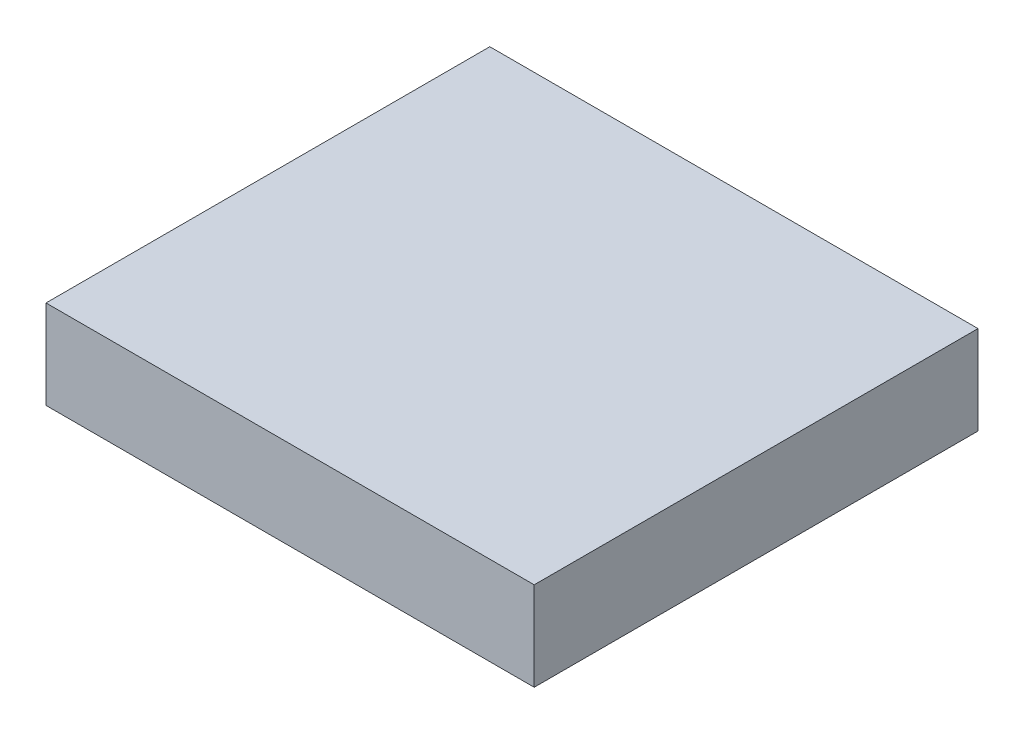
ISO-10303-21;
HEADER;
FILE_DESCRIPTION(('STEP AP214'),'2;1');
FILE_NAME('part.step','',(''),(''),'','','');
FILE_SCHEMA(('AUTOMOTIVE_DESIGN { 1 0 10303 214 1 1 1 1 }'));
ENDSEC;
DATA;
#1=APPLICATION_CONTEXT('core data for automotive mechanical design processes');
#2=APPLICATION_PROTOCOL_DEFINITION('international standard','automotive_design',2000,#1);
#3=PRODUCT_CONTEXT('',#1,'mechanical');
#4=PRODUCT('Part','Part','',(#3));
#5=PRODUCT_RELATED_PRODUCT_CATEGORY('part','',(#4));
#6=PRODUCT_DEFINITION_FORMATION('','',#4);
#7=PRODUCT_DEFINITION_CONTEXT('part definition',#1,'design');
#8=PRODUCT_DEFINITION('design','',#6,#7);
#9=PRODUCT_DEFINITION_SHAPE('','',#8);
#10=(LENGTH_UNIT() NAMED_UNIT(*) SI_UNIT(.MILLI.,.METRE.));
#11=(NAMED_UNIT(*) PLANE_ANGLE_UNIT() SI_UNIT($,.RADIAN.));
#12=(NAMED_UNIT(*) SI_UNIT($,.STERADIAN.) SOLID_ANGLE_UNIT());
#13=UNCERTAINTY_MEASURE_WITH_UNIT(LENGTH_MEASURE(1.E-05),#10,'distance_accuracy_value','');
#14=(GEOMETRIC_REPRESENTATION_CONTEXT(3) GLOBAL_UNCERTAINTY_ASSIGNED_CONTEXT((#13)) GLOBAL_UNIT_ASSIGNED_CONTEXT((#10,
#11,#12)) REPRESENTATION_CONTEXT('',''));
#15=CARTESIAN_POINT('',(0.,0.,0.));
#16=DIRECTION('',(0.,0.,1.));
#17=DIRECTION('',(1.,0.,0.));
#18=AXIS2_PLACEMENT_3D('',#15,#16,#17);
#19=CARTESIAN_POINT('',(5.5,2.,-5.));
#20=DIRECTION('',(-1.,0.,0.));
#21=DIRECTION('',(0.,0.,1.));
#22=AXIS2_PLACEMENT_3D('',#19,#20,#21);
#23=PLANE('',#22);
#24=DIRECTION('',(0.,0.,-1.));
#25=VECTOR('',#24,1.);
#26=CARTESIAN_POINT('',(5.5,0.,-5.));
#27=LINE('',#26,#25);
#28=CARTESIAN_POINT('',(5.5,0.,5.));
#29=VERTEX_POINT('',#28);
#30=CARTESIAN_POINT('',(5.5,0.,-5.));
#31=VERTEX_POINT('',#30);
#32=EDGE_CURVE('E96',#29,#31,#27,.T.);
#33=ORIENTED_EDGE('',*,*,#32,.T.);
#34=DIRECTION('',(0.,-1.,0.));
#35=VECTOR('',#34,1.);
#36=CARTESIAN_POINT('',(5.5,2.,-5.));
#37=LINE('',#36,#35);
#38=CARTESIAN_POINT('',(5.5,2.,-5.));
#39=VERTEX_POINT('',#38);
#40=EDGE_CURVE('E11',#39,#31,#37,.T.);
#41=ORIENTED_EDGE('',*,*,#40,.F.);
#42=DIRECTION('',(0.,0.,-1.));
#43=VECTOR('',#42,1.);
#44=CARTESIAN_POINT('',(5.5,2.,-5.));
#45=LINE('',#44,#43);
#46=CARTESIAN_POINT('',(5.5,2.,5.));
#47=VERTEX_POINT('',#46);
#48=EDGE_CURVE('E84',#47,#39,#45,.T.);
#49=ORIENTED_EDGE('',*,*,#48,.F.);
#50=DIRECTION('',(0.,-1.,0.));
#51=VECTOR('',#50,1.);
#52=CARTESIAN_POINT('',(5.5,2.,5.));
#53=LINE('',#52,#51);
#54=EDGE_CURVE('E92',#47,#29,#53,.T.);
#55=ORIENTED_EDGE('',*,*,#54,.T.);
#56=EDGE_LOOP('',(#33,#41,#49,#55));
#57=FACE_BOUND('',#56,.T.);
#58=ADVANCED_FACE('F33',(#57),#23,.F.);
#59=CARTESIAN_POINT('',(-5.5,2.,-5.));
#60=DIRECTION('',(0.,0.,1.));
#61=DIRECTION('',(1.,0.,0.));
#62=AXIS2_PLACEMENT_3D('',#59,#60,#61);
#63=PLANE('',#62);
#64=DIRECTION('',(-1.,0.,0.));
#65=VECTOR('',#64,1.);
#66=CARTESIAN_POINT('',(-5.5,0.,-5.));
#67=LINE('',#66,#65);
#68=CARTESIAN_POINT('',(-5.5,0.,-5.));
#69=VERTEX_POINT('',#68);
#70=EDGE_CURVE('E88',#31,#69,#67,.T.);
#71=ORIENTED_EDGE('',*,*,#70,.T.);
#72=DIRECTION('',(0.,-1.,0.));
#73=VECTOR('',#72,1.);
#74=CARTESIAN_POINT('',(-5.5,2.,-5.));
#75=LINE('',#74,#73);
#76=CARTESIAN_POINT('',(-5.5,2.,-5.));
#77=VERTEX_POINT('',#76);
#78=EDGE_CURVE('E41',#77,#69,#75,.T.);
#79=ORIENTED_EDGE('',*,*,#78,.F.);
#80=DIRECTION('',(-1.,0.,0.));
#81=VECTOR('',#80,1.);
#82=CARTESIAN_POINT('',(-5.5,2.,-5.));
#83=LINE('',#82,#81);
#84=EDGE_CURVE('E79',#39,#77,#83,.T.);
#85=ORIENTED_EDGE('',*,*,#84,.F.);
#86=ORIENTED_EDGE('',*,*,#40,.T.);
#87=EDGE_LOOP('',(#71,#79,#85,#86));
#88=FACE_BOUND('',#87,.T.);
#89=ADVANCED_FACE('F87',(#88),#63,.F.);
#90=CARTESIAN_POINT('',(-5.5,2.,-5.));
#91=DIRECTION('',(1.,0.,0.));
#92=DIRECTION('',(0.,0.,-1.));
#93=AXIS2_PLACEMENT_3D('',#90,#91,#92);
#94=PLANE('',#93);
#95=DIRECTION('',(0.,0.,1.));
#96=VECTOR('',#95,1.);
#97=CARTESIAN_POINT('',(-5.5,0.,-5.));
#98=LINE('',#97,#96);
#99=CARTESIAN_POINT('',(-5.5,0.,5.));
#100=VERTEX_POINT('',#99);
#101=EDGE_CURVE('E66',#69,#100,#98,.T.);
#102=ORIENTED_EDGE('',*,*,#101,.T.);
#103=DIRECTION('',(0.,-1.,0.));
#104=VECTOR('',#103,1.);
#105=CARTESIAN_POINT('',(-5.5,2.,5.));
#106=LINE('',#105,#104);
#107=CARTESIAN_POINT('',(-5.5,2.,5.));
#108=VERTEX_POINT('',#107);
#109=EDGE_CURVE('E89',#108,#100,#106,.T.);
#110=ORIENTED_EDGE('',*,*,#109,.F.);
#111=DIRECTION('',(0.,0.,1.));
#112=VECTOR('',#111,1.);
#113=CARTESIAN_POINT('',(-5.5,2.,-5.));
#114=LINE('',#113,#112);
#115=EDGE_CURVE('E82',#77,#108,#114,.T.);
#116=ORIENTED_EDGE('',*,*,#115,.F.);
#117=ORIENTED_EDGE('',*,*,#78,.T.);
#118=EDGE_LOOP('',(#102,#110,#116,#117));
#119=FACE_BOUND('',#118,.T.);
#120=ADVANCED_FACE('F90',(#119),#94,.F.);
#121=CARTESIAN_POINT('',(-5.5,2.,5.));
#122=DIRECTION('',(0.,0.,-1.));
#123=DIRECTION('',(-1.,0.,0.));
#124=AXIS2_PLACEMENT_3D('',#121,#122,#123);
#125=PLANE('',#124);
#126=DIRECTION('',(1.,0.,0.));
#127=VECTOR('',#126,1.);
#128=CARTESIAN_POINT('',(-5.5,0.,5.));
#129=LINE('',#128,#127);
#130=EDGE_CURVE('E72',#100,#29,#129,.T.);
#131=ORIENTED_EDGE('',*,*,#130,.T.);
#132=ORIENTED_EDGE('',*,*,#54,.F.);
#133=DIRECTION('',(1.,0.,0.));
#134=VECTOR('',#133,1.);
#135=CARTESIAN_POINT('',(-5.5,2.,5.));
#136=LINE('',#135,#134);
#137=EDGE_CURVE('E49',#108,#47,#136,.T.);
#138=ORIENTED_EDGE('',*,*,#137,.F.);
#139=ORIENTED_EDGE('',*,*,#109,.T.);
#140=EDGE_LOOP('',(#131,#132,#138,#139));
#141=FACE_BOUND('',#140,.T.);
#142=ADVANCED_FACE('F103',(#141),#125,.F.);
#143=CARTESIAN_POINT('',(0.,2.,0.));
#144=DIRECTION('',(0.,1.,0.));
#145=DIRECTION('',(0.,0.,1.));
#146=AXIS2_PLACEMENT_3D('',#143,#144,#145);
#147=PLANE('',#146);
#148=ORIENTED_EDGE('',*,*,#48,.T.);
#149=ORIENTED_EDGE('',*,*,#84,.T.);
#150=ORIENTED_EDGE('',*,*,#115,.T.);
#151=ORIENTED_EDGE('',*,*,#137,.T.);
#152=EDGE_LOOP('',(#148,#149,#150,#151));
#153=FACE_BOUND('',#152,.T.);
#154=ADVANCED_FACE('F80',(#153),#147,.T.);
#155=CARTESIAN_POINT('',(0.,0.,0.));
#156=DIRECTION('',(0.,1.,0.));
#157=DIRECTION('',(0.,0.,1.));
#158=AXIS2_PLACEMENT_3D('',#155,#156,#157);
#159=PLANE('',#158);
#160=ORIENTED_EDGE('',*,*,#32,.F.);
#161=ORIENTED_EDGE('',*,*,#130,.F.);
#162=ORIENTED_EDGE('',*,*,#101,.F.);
#163=ORIENTED_EDGE('',*,*,#70,.F.);
#164=EDGE_LOOP('',(#160,#161,#162,#163));
#165=FACE_BOUND('',#164,.T.);
#166=ADVANCED_FACE('F106',(#165),#159,.F.);
#167=CLOSED_SHELL('',(#58,#89,#120,#142,#154,#166));
#168=MANIFOLD_SOLID_BREP('B2',#167);
#169=ADVANCED_BREP_SHAPE_REPRESENTATION('',(#18,#168),#14);
#170=SHAPE_DEFINITION_REPRESENTATION(#9,#169);
ENDSEC;
END-ISO-10303-21;
